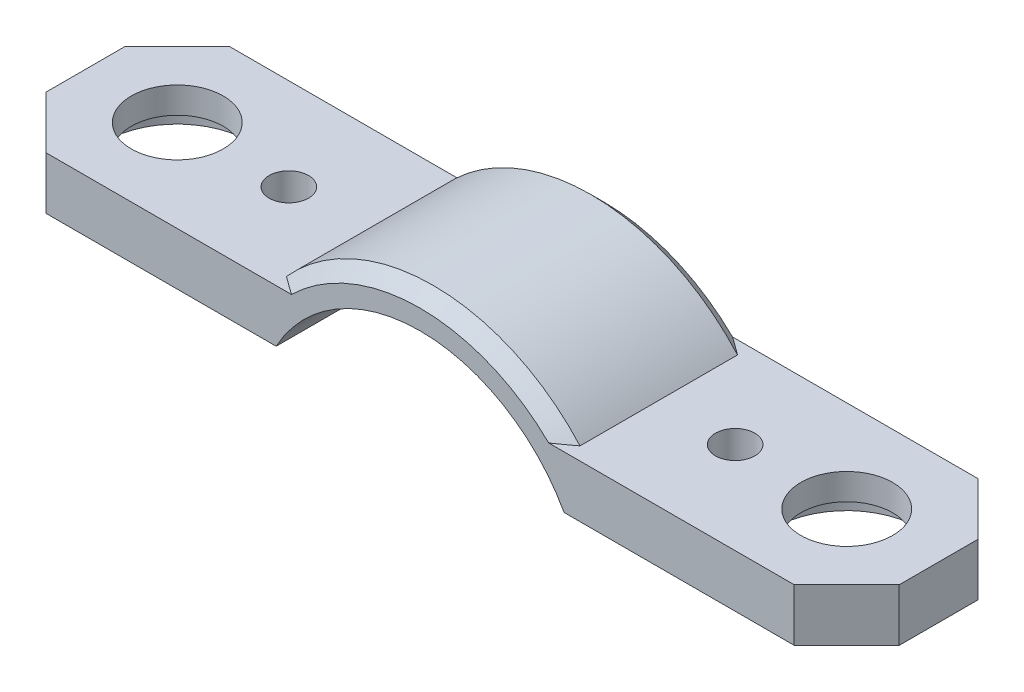
ISO-10303-21;
HEADER;
FILE_DESCRIPTION(('STEP AP214'),'2;1');
FILE_NAME('part.step','',(''),(''),'','','');
FILE_SCHEMA(('AUTOMOTIVE_DESIGN { 1 0 10303 214 1 1 1 1 }'));
ENDSEC;
DATA;
#1=APPLICATION_CONTEXT('core data for automotive mechanical design processes');
#2=APPLICATION_PROTOCOL_DEFINITION('international standard','automotive_design',2000,#1);
#3=PRODUCT_CONTEXT('',#1,'mechanical');
#4=PRODUCT('Part','Part','',(#3));
#5=PRODUCT_RELATED_PRODUCT_CATEGORY('part','',(#4));
#6=PRODUCT_DEFINITION_FORMATION('','',#4);
#7=PRODUCT_DEFINITION_CONTEXT('part definition',#1,'design');
#8=PRODUCT_DEFINITION('design','',#6,#7);
#9=PRODUCT_DEFINITION_SHAPE('','',#8);
#10=(LENGTH_UNIT() NAMED_UNIT(*) SI_UNIT(.MILLI.,.METRE.));
#11=(NAMED_UNIT(*) PLANE_ANGLE_UNIT() SI_UNIT($,.RADIAN.));
#12=(NAMED_UNIT(*) SI_UNIT($,.STERADIAN.) SOLID_ANGLE_UNIT());
#13=UNCERTAINTY_MEASURE_WITH_UNIT(LENGTH_MEASURE(1.E-05),#10,'distance_accuracy_value','');
#14=(GEOMETRIC_REPRESENTATION_CONTEXT(3) GLOBAL_UNCERTAINTY_ASSIGNED_CONTEXT((#13)) GLOBAL_UNIT_ASSIGNED_CONTEXT((#10,
#11,#12)) REPRESENTATION_CONTEXT('',''));
#15=CARTESIAN_POINT('',(0.,0.,0.));
#16=DIRECTION('',(0.,0.,1.));
#17=DIRECTION('',(1.,0.,0.));
#18=AXIS2_PLACEMENT_3D('',#15,#16,#17);
#19=CARTESIAN_POINT('',(0.,-4.,0.));
#20=DIRECTION('',(0.,1.,0.));
#21=DIRECTION('',(0.,0.,1.));
#22=AXIS2_PLACEMENT_3D('',#19,#20,#21);
#23=PLANE('',#22);
#24=CARTESIAN_POINT('',(13.6739012317805,-4.,2.35283109435819));
#25=DIRECTION('',(0.,1.,0.));
#26=DIRECTION('',(0.,0.,1.));
#27=AXIS2_PLACEMENT_3D('',#24,#25,#26);
#28=CIRCLE('',#27,1.5);
#29=CARTESIAN_POINT('',(13.6739012317805,-4.,3.85283109435819));
#30=VERTEX_POINT('',#29);
#31=EDGE_CURVE('E541',#30,#30,#28,.T.);
#32=ORIENTED_EDGE('',*,*,#31,.T.);
#33=EDGE_LOOP('',(#32));
#34=FACE_BOUND('',#33,.T.);
#35=CARTESIAN_POINT('',(22.1739012317805,-4.,2.35283109435819));
#36=DIRECTION('',(0.,-1.,0.));
#37=DIRECTION('',(0.,0.,-1.));
#38=AXIS2_PLACEMENT_3D('',#35,#36,#37);
#39=CIRCLE('',#38,5.5);
#40=CARTESIAN_POINT('',(22.1739012317805,-4.,-3.1471689056418));
#41=VERTEX_POINT('',#40);
#42=EDGE_CURVE('E287',#41,#41,#39,.T.);
#43=ORIENTED_EDGE('',*,*,#42,.F.);
#44=EDGE_LOOP('',(#43));
#45=FACE_BOUND('',#44,.T.);
#46=DIRECTION('',(0.,0.,-1.));
#47=VECTOR('',#46,1.);
#48=CARTESIAN_POINT('',(29.1739012317805,-4.,-4.64716890564181));
#49=LINE('',#48,#47);
#50=CARTESIAN_POINT('',(29.1739012317805,-4.,5.35283109435819));
#51=VERTEX_POINT('',#50);
#52=CARTESIAN_POINT('',(29.1739012317805,-4.,-0.647168905641816));
#53=VERTEX_POINT('',#52);
#54=EDGE_CURVE('E159',#51,#53,#49,.T.);
#55=ORIENTED_EDGE('',*,*,#54,.F.);
#56=DIRECTION('',(0.707106781186546,0.,-0.707106781186549));
#57=VECTOR('',#56,1.);
#58=CARTESIAN_POINT('',(25.1739012317806,-4.,9.35283109435819));
#59=LINE('',#58,#57);
#60=CARTESIAN_POINT('',(25.1739012317806,-4.,9.35283109435819));
#61=VERTEX_POINT('',#60);
#62=EDGE_CURVE('E301',#51,#61,#59,.F.);
#63=ORIENTED_EDGE('',*,*,#62,.T.);
#64=DIRECTION('',(1.,0.,0.));
#65=VECTOR('',#64,1.);
#66=CARTESIAN_POINT('',(-35.8260987682195,-4.,9.35283109435819));
#67=LINE('',#66,#65);
#68=CARTESIAN_POINT('',(7.6397573315112,-4.,9.35283109435819));
#69=VERTEX_POINT('',#68);
#70=EDGE_CURVE('E291',#69,#61,#67,.T.);
#71=ORIENTED_EDGE('',*,*,#70,.F.);
#72=DIRECTION('',(0.,0.,-1.));
#73=VECTOR('',#72,1.);
#74=CARTESIAN_POINT('',(7.6397573315112,-4.,9.35283109435819));
#75=LINE('',#74,#73);
#76=CARTESIAN_POINT('',(7.6397573315112,-4.,-4.64716890564181));
#77=VERTEX_POINT('',#76);
#78=EDGE_CURVE('E143',#69,#77,#75,.T.);
#79=ORIENTED_EDGE('',*,*,#78,.T.);
#80=DIRECTION('',(-1.,0.,0.));
#81=VECTOR('',#80,1.);
#82=CARTESIAN_POINT('',(-35.8260987682195,-4.,-4.64716890564181));
#83=LINE('',#82,#81);
#84=CARTESIAN_POINT('',(25.1739012317805,-4.,-4.64716890564181));
#85=VERTEX_POINT('',#84);
#86=EDGE_CURVE('E154',#85,#77,#83,.T.);
#87=ORIENTED_EDGE('',*,*,#86,.F.);
#88=DIRECTION('',(-0.707106781186549,0.,-0.707106781186546));
#89=VECTOR('',#88,1.);
#90=CARTESIAN_POINT('',(29.1739012317805,-4.,-0.647168905641817));
#91=LINE('',#90,#89);
#92=EDGE_CURVE('E314',#85,#53,#91,.F.);
#93=ORIENTED_EDGE('',*,*,#92,.T.);
#94=EDGE_LOOP('',(#55,#63,#71,#79,#87,#93));
#95=FACE_BOUND('',#94,.T.);
#96=ADVANCED_FACE('F33',(#34,#45,#95),#23,.F.);
#97=CARTESIAN_POINT('',(0.,0.,0.));
#98=DIRECTION('',(0.,1.,0.));
#99=DIRECTION('',(0.,0.,1.));
#100=AXIS2_PLACEMENT_3D('',#97,#98,#99);
#101=PLANE('',#100);
#102=CARTESIAN_POINT('',(13.6739012317805,0.,2.35283109435819));
#103=DIRECTION('',(0.,1.,0.));
#104=DIRECTION('',(0.,0.,1.));
#105=AXIS2_PLACEMENT_3D('',#102,#103,#104);
#106=CIRCLE('',#105,1.5);
#107=CARTESIAN_POINT('',(13.6739012317805,0.,3.85283109435819));
#108=VERTEX_POINT('',#107);
#109=EDGE_CURVE('E544',#108,#108,#106,.T.);
#110=ORIENTED_EDGE('',*,*,#109,.F.);
#111=EDGE_LOOP('',(#110));
#112=FACE_BOUND('',#111,.T.);
#113=DIRECTION('',(1.,0.,0.));
#114=VECTOR('',#113,1.);
#115=CARTESIAN_POINT('',(-35.8260987682195,0.,9.35283109435819));
#116=LINE('',#115,#114);
#117=CARTESIAN_POINT('',(6.47186020291324,0.,9.35283109435819));
#118=VERTEX_POINT('',#117);
#119=CARTESIAN_POINT('',(25.1739012317806,0.,9.35283109435819));
#120=VERTEX_POINT('',#119);
#121=EDGE_CURVE('E170',#118,#120,#116,.T.);
#122=ORIENTED_EDGE('',*,*,#121,.T.);
#123=DIRECTION('',(-0.707106781186546,0.,0.707106781186549));
#124=VECTOR('',#123,1.);
#125=CARTESIAN_POINT('',(17.2633661630694,0.,17.2633661630694));
#126=LINE('',#125,#124);
#127=CARTESIAN_POINT('',(29.1739012317805,0.,5.35283109435819));
#128=VERTEX_POINT('',#127);
#129=EDGE_CURVE('E302',#120,#128,#126,.F.);
#130=ORIENTED_EDGE('',*,*,#129,.T.);
#131=DIRECTION('',(0.,0.,-1.));
#132=VECTOR('',#131,1.);
#133=CARTESIAN_POINT('',(29.1739012317805,0.,-4.64716890564181));
#134=LINE('',#133,#132);
#135=CARTESIAN_POINT('',(29.1739012317805,0.,-0.647168905641813));
#136=VERTEX_POINT('',#135);
#137=EDGE_CURVE('E174',#128,#136,#134,.T.);
#138=ORIENTED_EDGE('',*,*,#137,.T.);
#139=DIRECTION('',(0.707106781186549,0.,0.707106781186546));
#140=VECTOR('',#139,1.);
#141=CARTESIAN_POINT('',(14.9105350687111,0.,-14.9105350687112));
#142=LINE('',#141,#140);
#143=CARTESIAN_POINT('',(25.1739012317805,0.,-4.64716890564181));
#144=VERTEX_POINT('',#143);
#145=EDGE_CURVE('E303',#136,#144,#142,.F.);
#146=ORIENTED_EDGE('',*,*,#145,.T.);
#147=DIRECTION('',(-1.,0.,0.));
#148=VECTOR('',#147,1.);
#149=CARTESIAN_POINT('',(-35.8260987682195,0.,-4.64716890564181));
#150=LINE('',#149,#148);
#151=CARTESIAN_POINT('',(6.47186020291327,0.,-4.64716890564181));
#152=VERTEX_POINT('',#151);
#153=EDGE_CURVE('E178',#144,#152,#150,.T.);
#154=ORIENTED_EDGE('',*,*,#153,.T.);
#155=CARTESIAN_POINT('',(6.47186020291327,0.,-4.64716890564181));
#156=CARTESIAN_POINT('',(6.58835406583274,0.,-4.56563878984489));
#157=CARTESIAN_POINT('',(6.7045002071197,0.,-4.48361298310186));
#158=CARTESIAN_POINT('',(6.93612812483899,0.,-4.31864203807849));
#159=CARTESIAN_POINT('',(7.05160993790389,0.,-4.23569695124202));
#160=CARTESIAN_POINT('',(7.28195258256229,0.,-4.06895087953328));
#161=CARTESIAN_POINT('',(7.39681341770906,0.,-3.98514989956645));
#162=CARTESIAN_POINT('',(7.62595525736224,0.,-3.81674548549887));
#163=CARTESIAN_POINT('',(7.74023622922977,0.,-3.7321420069802));
#164=CARTESIAN_POINT('',(7.85424111927951,0.,-3.64716890564184));
#165=B_SPLINE_CURVE_WITH_KNOTS('',3,(#155,#156,#157,#158,#159,#160,#161,#162,#163,#164),
.UNSPECIFIED.,.F.,.F.,(4,2,2,2,4),(0.,0.426567590976708,0.853111430127949,1.27965282597465,
1.70621797007616),.UNSPECIFIED.);
#166=CARTESIAN_POINT('',(7.85424111927949,0.,-3.64716890564182));
#167=VERTEX_POINT('',#166);
#168=EDGE_CURVE('E228',#152,#167,#165,.T.);
#169=ORIENTED_EDGE('',*,*,#168,.T.);
#170=DIRECTION('',(0.,0.,-1.));
#171=VECTOR('',#170,1.);
#172=CARTESIAN_POINT('',(7.85424111927949,0.,9.35283109435819));
#173=LINE('',#172,#171);
#174=CARTESIAN_POINT('',(7.85424111927949,0.,8.3528310943582));
#175=VERTEX_POINT('',#174);
#176=EDGE_CURVE('E144',#175,#167,#173,.T.);
#177=ORIENTED_EDGE('',*,*,#176,.F.);
#178=CARTESIAN_POINT('',(7.85424111927949,0.,8.3528310943582));
#179=CARTESIAN_POINT('',(7.74023622922976,0.,8.43780419569658));
#180=CARTESIAN_POINT('',(7.62595525736224,0.,8.52240767421525));
#181=CARTESIAN_POINT('',(7.39681341770905,0.,8.69081208828284));
#182=CARTESIAN_POINT('',(7.28195258256228,0.,8.77461306824967));
#183=CARTESIAN_POINT('',(7.05160993790387,0.,8.9413591399584));
#184=CARTESIAN_POINT('',(6.93612812483897,0.,9.02430422679487));
#185=CARTESIAN_POINT('',(6.70450020711968,0.,9.18927517181825));
#186=CARTESIAN_POINT('',(6.58835406583272,0.,9.2713009785613));
#187=CARTESIAN_POINT('',(6.47186020291327,0.,9.35283109435824));
#188=B_SPLINE_CURVE_WITH_KNOTS('',3,(#178,#179,#180,#181,#182,#183,#184,#185,#186,#187),
.UNSPECIFIED.,.F.,.F.,(4,2,2,2,4),(0.,0.426565144101509,0.853106539948222,1.27965037909947,
1.70621797007619),.UNSPECIFIED.);
#189=EDGE_CURVE('E197',#175,#118,#188,.T.);
#190=ORIENTED_EDGE('',*,*,#189,.T.);
#191=EDGE_LOOP('',(#122,#130,#138,#146,#154,#169,#177,#190));
#192=FACE_BOUND('',#191,.T.);
#193=CARTESIAN_POINT('',(22.1739012317805,0.,2.35283109435819));
#194=DIRECTION('',(0.,-1.,0.));
#195=DIRECTION('',(0.,0.,-1.));
#196=AXIS2_PLACEMENT_3D('',#193,#194,#195);
#197=CIRCLE('',#196,3.5);
#198=CARTESIAN_POINT('',(22.1739012317805,0.,-1.14716890564181));
#199=VERTEX_POINT('',#198);
#200=EDGE_CURVE('E554',#199,#199,#197,.T.);
#201=ORIENTED_EDGE('',*,*,#200,.T.);
#202=EDGE_LOOP('',(#201));
#203=FACE_BOUND('',#202,.T.);
#204=ADVANCED_FACE('F221',(#112,#192,#203),#101,.T.);
#205=CARTESIAN_POINT('',(-35.8260987682195,-4.,-4.64716890564181));
#206=DIRECTION('',(-1.,0.,0.));
#207=DIRECTION('',(0.,0.,1.));
#208=AXIS2_PLACEMENT_3D('',#205,#206,#207);
#209=PLANE('',#208);
#210=DIRECTION('',(0.,0.,1.));
#211=VECTOR('',#210,1.);
#212=CARTESIAN_POINT('',(-35.8260987682195,-4.,-4.64716890564181));
#213=LINE('',#212,#211);
#214=CARTESIAN_POINT('',(-35.8260987682195,-4.,-0.647168905641802));
#215=VERTEX_POINT('',#214);
#216=CARTESIAN_POINT('',(-35.8260987682195,-4.,5.3528310943582));
#217=VERTEX_POINT('',#216);
#218=EDGE_CURVE('E180',#215,#217,#213,.T.);
#219=ORIENTED_EDGE('',*,*,#218,.T.);
#220=DIRECTION('',(0.,1.,0.));
#221=VECTOR('',#220,1.);
#222=CARTESIAN_POINT('',(-35.8260987682195,-4.,5.3528310943582));
#223=LINE('',#222,#221);
#224=CARTESIAN_POINT('',(-35.8260987682195,0.,5.35283109435819));
#225=VERTEX_POINT('',#224);
#226=EDGE_CURVE('E322',#217,#225,#223,.T.);
#227=ORIENTED_EDGE('',*,*,#226,.T.);
#228=DIRECTION('',(0.,0.,1.));
#229=VECTOR('',#228,1.);
#230=CARTESIAN_POINT('',(-35.8260987682195,0.,-4.64716890564181));
#231=LINE('',#230,#229);
#232=CARTESIAN_POINT('',(-35.8260987682195,0.,-0.647168905641802));
#233=VERTEX_POINT('',#232);
#234=EDGE_CURVE('E167',#233,#225,#231,.T.);
#235=ORIENTED_EDGE('',*,*,#234,.F.);
#236=DIRECTION('',(0.,-1.,0.));
#237=VECTOR('',#236,1.);
#238=CARTESIAN_POINT('',(-35.8260987682195,-4.,-0.647168905641802));
#239=LINE('',#238,#237);
#240=EDGE_CURVE('E53',#233,#215,#239,.T.);
#241=ORIENTED_EDGE('',*,*,#240,.T.);
#242=EDGE_LOOP('',(#219,#227,#235,#241));
#243=FACE_BOUND('',#242,.T.);
#244=ADVANCED_FACE('F262',(#243),#209,.T.);
#245=CARTESIAN_POINT('',(-35.8260987682195,-4.,-4.64716890564181));
#246=DIRECTION('',(0.,0.,-1.));
#247=DIRECTION('',(-1.,0.,0.));
#248=AXIS2_PLACEMENT_3D('',#245,#246,#247);
#249=PLANE('',#248);
#250=ORIENTED_EDGE('',*,*,#153,.F.);
#251=DIRECTION('',(0.,-1.,0.));
#252=VECTOR('',#251,1.);
#253=CARTESIAN_POINT('',(25.1739012317805,-4.,-4.64716890564181));
#254=LINE('',#253,#252);
#255=EDGE_CURVE('E319',#144,#85,#254,.T.);
#256=ORIENTED_EDGE('',*,*,#255,.T.);
#257=ORIENTED_EDGE('',*,*,#86,.T.);
#258=CARTESIAN_POINT('',(-3.32609876821946,-10.,-4.64716890564181));
#259=DIRECTION('',(0.,0.,-1.));
#260=DIRECTION('',(-1.,0.,0.));
#261=AXIS2_PLACEMENT_3D('',#258,#259,#260);
#262=CIRCLE('',#261,12.5);
#263=CARTESIAN_POINT('',(-14.2919548679501,-4.,-4.64716890564181));
#264=VERTEX_POINT('',#263);
#265=EDGE_CURVE('E138',#264,#77,#262,.T.);
#266=ORIENTED_EDGE('',*,*,#265,.F.);
#267=CARTESIAN_POINT('',(-31.8260987682195,-4.,-4.64716890564181));
#268=VERTEX_POINT('',#267);
#269=EDGE_CURVE('E151',#264,#268,#83,.T.);
#270=ORIENTED_EDGE('',*,*,#269,.T.);
#271=DIRECTION('',(0.,1.,0.));
#272=VECTOR('',#271,1.);
#273=CARTESIAN_POINT('',(-31.8260987682195,-4.,-4.64716890564181));
#274=LINE('',#273,#272);
#275=CARTESIAN_POINT('',(-31.8260987682195,0.,-4.64716890564181));
#276=VERTEX_POINT('',#275);
#277=EDGE_CURVE('E317',#268,#276,#274,.T.);
#278=ORIENTED_EDGE('',*,*,#277,.T.);
#279=CARTESIAN_POINT('',(-13.1240577393522,0.,-4.64716890564181));
#280=VERTEX_POINT('',#279);
#281=EDGE_CURVE('E177',#280,#276,#150,.T.);
#282=ORIENTED_EDGE('',*,*,#281,.F.);
#283=CARTESIAN_POINT('',(-3.32609876821946,-10.,-4.64716890564181));
#284=DIRECTION('',(0.,0.,-1.));
#285=DIRECTION('',(-1.,0.,0.));
#286=AXIS2_PLACEMENT_3D('',#283,#284,#285);
#287=CIRCLE('',#286,14.);
#288=EDGE_CURVE('E194',#280,#152,#287,.T.);
#289=ORIENTED_EDGE('',*,*,#288,.T.);
#290=EDGE_LOOP('',(#250,#256,#257,#266,#270,#278,#282,#289));
#291=FACE_BOUND('',#290,.T.);
#292=ADVANCED_FACE('F149',(#291),#249,.T.);
#293=CARTESIAN_POINT('',(29.1739012317805,-4.,-4.64716890564181));
#294=DIRECTION('',(1.,0.,0.));
#295=DIRECTION('',(0.,0.,-1.));
#296=AXIS2_PLACEMENT_3D('',#293,#294,#295);
#297=PLANE('',#296);
#298=ORIENTED_EDGE('',*,*,#137,.F.);
#299=DIRECTION('',(0.,-1.,0.));
#300=VECTOR('',#299,1.);
#301=CARTESIAN_POINT('',(29.1739012317805,-4.,5.35283109435819));
#302=LINE('',#301,#300);
#303=EDGE_CURVE('E312',#128,#51,#302,.T.);
#304=ORIENTED_EDGE('',*,*,#303,.T.);
#305=ORIENTED_EDGE('',*,*,#54,.T.);
#306=DIRECTION('',(0.,1.,0.));
#307=VECTOR('',#306,1.);
#308=CARTESIAN_POINT('',(29.1739012317805,-4.,-0.647168905641817));
#309=LINE('',#308,#307);
#310=EDGE_CURVE('E309',#53,#136,#309,.T.);
#311=ORIENTED_EDGE('',*,*,#310,.T.);
#312=EDGE_LOOP('',(#298,#304,#305,#311));
#313=FACE_BOUND('',#312,.T.);
#314=ADVANCED_FACE('F272',(#313),#297,.T.);
#315=CARTESIAN_POINT('',(-35.8260987682195,-4.,9.35283109435819));
#316=DIRECTION('',(0.,0.,1.));
#317=DIRECTION('',(1.,0.,0.));
#318=AXIS2_PLACEMENT_3D('',#315,#316,#317);
#319=PLANE('',#318);
#320=ORIENTED_EDGE('',*,*,#70,.T.);
#321=DIRECTION('',(0.,1.,0.));
#322=VECTOR('',#321,1.);
#323=CARTESIAN_POINT('',(25.1739012317806,-4.,9.35283109435819));
#324=LINE('',#323,#322);
#325=EDGE_CURVE('E296',#61,#120,#324,.T.);
#326=ORIENTED_EDGE('',*,*,#325,.T.);
#327=ORIENTED_EDGE('',*,*,#121,.F.);
#328=CARTESIAN_POINT('',(-3.32609876821946,-10.,9.35283109435819));
#329=DIRECTION('',(0.,0.,1.));
#330=DIRECTION('',(1.,0.,0.));
#331=AXIS2_PLACEMENT_3D('',#328,#329,#330);
#332=CIRCLE('',#331,14.);
#333=CARTESIAN_POINT('',(-13.1240577393522,0.,9.35283109435819));
#334=VERTEX_POINT('',#333);
#335=EDGE_CURVE('E191',#118,#334,#332,.T.);
#336=ORIENTED_EDGE('',*,*,#335,.T.);
#337=CARTESIAN_POINT('',(-31.8260987682194,0.,9.35283109435819));
#338=VERTEX_POINT('',#337);
#339=EDGE_CURVE('E172',#338,#334,#116,.T.);
#340=ORIENTED_EDGE('',*,*,#339,.F.);
#341=DIRECTION('',(0.,-1.,0.));
#342=VECTOR('',#341,1.);
#343=CARTESIAN_POINT('',(-31.8260987682194,-4.,9.35283109435819));
#344=LINE('',#343,#342);
#345=CARTESIAN_POINT('',(-31.8260987682194,-4.,9.35283109435819));
#346=VERTEX_POINT('',#345);
#347=EDGE_CURVE('E304',#338,#346,#344,.T.);
#348=ORIENTED_EDGE('',*,*,#347,.T.);
#349=CARTESIAN_POINT('',(-14.2919548679501,-4.,9.35283109435819));
#350=VERTEX_POINT('',#349);
#351=EDGE_CURVE('E163',#346,#350,#67,.T.);
#352=ORIENTED_EDGE('',*,*,#351,.T.);
#353=CARTESIAN_POINT('',(-3.32609876821946,-10.,9.35283109435819));
#354=DIRECTION('',(0.,0.,-1.));
#355=DIRECTION('',(-1.,0.,0.));
#356=AXIS2_PLACEMENT_3D('',#353,#354,#355);
#357=CIRCLE('',#356,12.5);
#358=EDGE_CURVE('E141',#350,#69,#357,.T.);
#359=ORIENTED_EDGE('',*,*,#358,.T.);
#360=EDGE_LOOP('',(#320,#326,#327,#336,#340,#348,#352,#359));
#361=FACE_BOUND('',#360,.T.);
#362=ADVANCED_FACE('F267',(#361),#319,.T.);
#363=CARTESIAN_POINT('',(-20.3260987682195,-4.,2.35283109435819));
#364=DIRECTION('',(0.,1.,0.));
#365=DIRECTION('',(0.,0.,1.));
#366=AXIS2_PLACEMENT_3D('',#363,#364,#365);
#367=CIRCLE('',#366,1.5);
#368=CARTESIAN_POINT('',(-20.3260987682195,-4.,3.85283109435819));
#369=VERTEX_POINT('',#368);
#370=EDGE_CURVE('E155',#369,#369,#367,.T.);
#371=ORIENTED_EDGE('',*,*,#370,.T.);
#372=EDGE_LOOP('',(#371));
#373=FACE_BOUND('',#372,.T.);
#374=CARTESIAN_POINT('',(-28.8260987682195,-4.,2.35283109435819));
#375=DIRECTION('',(0.,-1.,0.));
#376=DIRECTION('',(0.,0.,-1.));
#377=AXIS2_PLACEMENT_3D('',#374,#375,#376);
#378=CIRCLE('',#377,5.5);
#379=CARTESIAN_POINT('',(-28.8260987682195,-4.,-3.1471689056418));
#380=VERTEX_POINT('',#379);
#381=EDGE_CURVE('E280',#380,#380,#378,.T.);
#382=ORIENTED_EDGE('',*,*,#381,.F.);
#383=EDGE_LOOP('',(#382));
#384=FACE_BOUND('',#383,.T.);
#385=ORIENTED_EDGE('',*,*,#351,.F.);
#386=DIRECTION('',(0.707106781186549,0.,0.707106781186546));
#387=VECTOR('',#386,1.);
#388=CARTESIAN_POINT('',(-35.8260987682195,-4.,5.3528310943582));
#389=LINE('',#388,#387);
#390=EDGE_CURVE('E11',#346,#217,#389,.F.);
#391=ORIENTED_EDGE('',*,*,#390,.T.);
#392=ORIENTED_EDGE('',*,*,#218,.F.);
#393=DIRECTION('',(-0.707106781186546,0.,0.707106781186549));
#394=VECTOR('',#393,1.);
#395=CARTESIAN_POINT('',(-31.8260987682195,-4.,-4.64716890564181));
#396=LINE('',#395,#394);
#397=EDGE_CURVE('E41',#215,#268,#396,.F.);
#398=ORIENTED_EDGE('',*,*,#397,.T.);
#399=ORIENTED_EDGE('',*,*,#269,.F.);
#400=DIRECTION('',(0.,0.,-1.));
#401=VECTOR('',#400,1.);
#402=CARTESIAN_POINT('',(-14.2919548679501,-4.,9.35283109435819));
#403=LINE('',#402,#401);
#404=EDGE_CURVE('E135',#264,#350,#403,.F.);
#405=ORIENTED_EDGE('',*,*,#404,.T.);
#406=EDGE_LOOP('',(#385,#391,#392,#398,#399,#405));
#407=FACE_BOUND('',#406,.T.);
#408=ADVANCED_FACE('F157',(#373,#384,#407),#23,.F.);
#409=CARTESIAN_POINT('',(-20.3260987682195,0.,2.35283109435819));
#410=DIRECTION('',(0.,1.,0.));
#411=DIRECTION('',(0.,0.,1.));
#412=AXIS2_PLACEMENT_3D('',#409,#410,#411);
#413=CIRCLE('',#412,1.5);
#414=CARTESIAN_POINT('',(-20.3260987682195,0.,3.85283109435819));
#415=VERTEX_POINT('',#414);
#416=EDGE_CURVE('E546',#415,#415,#413,.T.);
#417=ORIENTED_EDGE('',*,*,#416,.F.);
#418=EDGE_LOOP('',(#417));
#419=FACE_BOUND('',#418,.T.);
#420=ORIENTED_EDGE('',*,*,#234,.T.);
#421=DIRECTION('',(-0.707106781186549,0.,-0.707106781186546));
#422=VECTOR('',#421,1.);
#423=CARTESIAN_POINT('',(-20.5894649312888,0.,20.5894649312888));
#424=LINE('',#423,#422);
#425=EDGE_CURVE('E327',#225,#338,#424,.F.);
#426=ORIENTED_EDGE('',*,*,#425,.T.);
#427=ORIENTED_EDGE('',*,*,#339,.T.);
#428=CARTESIAN_POINT('',(-13.1240577393522,0.,9.35283109435819));
#429=CARTESIAN_POINT('',(-13.2405516022716,0.,9.27130097856128));
#430=CARTESIAN_POINT('',(-13.3566977435586,0.,9.18927517181825));
#431=CARTESIAN_POINT('',(-13.5883256612779,0.,9.02430422679488));
#432=CARTESIAN_POINT('',(-13.7038074743428,0.,8.9413591399584));
#433=CARTESIAN_POINT('',(-13.9341501190012,0.,8.77461306824967));
#434=CARTESIAN_POINT('',(-14.049010954148,0.,8.69081208828283));
#435=CARTESIAN_POINT('',(-14.2781527938012,0.,8.52240767421525));
#436=CARTESIAN_POINT('',(-14.3924337656687,0.,8.43780419569658));
#437=CARTESIAN_POINT('',(-14.5064386557184,0.,8.35283109435822));
#438=B_SPLINE_CURVE_WITH_KNOTS('',3,(#428,#429,#430,#431,#432,#433,#434,#435,#436,#437),
.UNSPECIFIED.,.F.,.F.,(4,2,2,2,4),(0.,0.426567590976716,0.853111430127964,1.27965282597467,
1.70621797007619),.UNSPECIFIED.);
#439=CARTESIAN_POINT('',(-14.5064386557184,0.,8.3528310943582));
#440=VERTEX_POINT('',#439);
#441=EDGE_CURVE('E205',#334,#440,#438,.T.);
#442=ORIENTED_EDGE('',*,*,#441,.T.);
#443=DIRECTION('',(0.,0.,-1.));
#444=VECTOR('',#443,1.);
#445=CARTESIAN_POINT('',(-14.5064386557184,0.,9.35283109435819));
#446=LINE('',#445,#444);
#447=CARTESIAN_POINT('',(-14.5064386557184,0.,-3.64716890564182));
#448=VERTEX_POINT('',#447);
#449=EDGE_CURVE('E161',#448,#440,#446,.F.);
#450=ORIENTED_EDGE('',*,*,#449,.F.);
#451=CARTESIAN_POINT('',(-14.5064386557184,0.,-3.64716890564182));
#452=CARTESIAN_POINT('',(-14.3924337656687,0.,-3.73214200698019));
#453=CARTESIAN_POINT('',(-14.2781527938012,0.,-3.81674548549887));
#454=CARTESIAN_POINT('',(-14.049010954148,0.,-3.98514989956645));
#455=CARTESIAN_POINT('',(-13.9341501190012,0.,-4.06895087953328));
#456=CARTESIAN_POINT('',(-13.7038074743428,0.,-4.23569695124201));
#457=CARTESIAN_POINT('',(-13.5883256612779,0.,-4.31864203807848));
#458=CARTESIAN_POINT('',(-13.3566977435586,0.,-4.48361298310186));
#459=CARTESIAN_POINT('',(-13.2405516022717,0.,-4.56563878984491));
#460=CARTESIAN_POINT('',(-13.1240577393522,0.,-4.64716890564185));
#461=B_SPLINE_CURVE_WITH_KNOTS('',3,(#451,#452,#453,#454,#455,#456,#457,#458,#459,#460),
.UNSPECIFIED.,.F.,.F.,(4,2,2,2,4),(0.,0.426565144101501,0.853106539948207,1.27965037909945,
1.70621797007616),.UNSPECIFIED.);
#462=EDGE_CURVE('E232',#448,#280,#461,.T.);
#463=ORIENTED_EDGE('',*,*,#462,.T.);
#464=ORIENTED_EDGE('',*,*,#281,.T.);
#465=DIRECTION('',(0.707106781186546,0.,-0.707106781186549));
#466=VECTOR('',#465,1.);
#467=CARTESIAN_POINT('',(-18.2366338369307,0.,-18.2366338369306));
#468=LINE('',#467,#466);
#469=EDGE_CURVE('E325',#276,#233,#468,.F.);
#470=ORIENTED_EDGE('',*,*,#469,.T.);
#471=EDGE_LOOP('',(#420,#426,#427,#442,#450,#463,#464,#470));
#472=FACE_BOUND('',#471,.T.);
#473=CARTESIAN_POINT('',(-28.8260987682195,0.,2.35283109435819));
#474=DIRECTION('',(0.,-1.,0.));
#475=DIRECTION('',(0.,0.,-1.));
#476=AXIS2_PLACEMENT_3D('',#473,#474,#475);
#477=CIRCLE('',#476,3.5);
#478=CARTESIAN_POINT('',(-28.8260987682195,0.,-1.14716890564181));
#479=VERTEX_POINT('',#478);
#480=EDGE_CURVE('E560',#479,#479,#477,.T.);
#481=ORIENTED_EDGE('',*,*,#480,.T.);
#482=EDGE_LOOP('',(#481));
#483=FACE_BOUND('',#482,.T.);
#484=ADVANCED_FACE('F214',(#419,#472,#483),#101,.T.);
#485=CARTESIAN_POINT('',(-28.8260987682195,-2.,2.35283109435819));
#486=DIRECTION('',(0.,-1.,0.));
#487=DIRECTION('',(0.,0.,-1.));
#488=AXIS2_PLACEMENT_3D('',#485,#486,#487);
#489=CYLINDRICAL_SURFACE('',#488,5.5);
#490=CARTESIAN_POINT('',(-28.8260987682195,-2.,2.35283109435819));
#491=DIRECTION('',(0.,-1.,0.));
#492=DIRECTION('',(0.,0.,-1.));
#493=AXIS2_PLACEMENT_3D('',#490,#491,#492);
#494=CIRCLE('',#493,5.5);
#495=CARTESIAN_POINT('',(-28.8260987682195,-2.,-3.1471689056418));
#496=VERTEX_POINT('',#495);
#497=EDGE_CURVE('E171',#496,#496,#494,.T.);
#498=ORIENTED_EDGE('',*,*,#497,.F.);
#499=EDGE_LOOP('',(#498));
#500=FACE_BOUND('',#499,.T.);
#501=ORIENTED_EDGE('',*,*,#381,.T.);
#502=EDGE_LOOP('',(#501));
#503=FACE_BOUND('',#502,.T.);
#504=ADVANCED_FACE('F219',(#500,#503),#489,.F.);
#505=CARTESIAN_POINT('',(-28.8260987682195,-2.,2.35283109435819));
#506=DIRECTION('',(0.,-1.,0.));
#507=DIRECTION('',(0.,0.,-1.));
#508=AXIS2_PLACEMENT_3D('',#505,#506,#507);
#509=PLANE('',#508);
#510=CARTESIAN_POINT('',(-28.8260987682195,-2.,2.35283109435819));
#511=DIRECTION('',(0.,-1.,0.));
#512=DIRECTION('',(0.,0.,-1.));
#513=AXIS2_PLACEMENT_3D('',#510,#511,#512);
#514=CIRCLE('',#513,3.5);
#515=CARTESIAN_POINT('',(-28.8260987682195,-2.,-1.14716890564181));
#516=VERTEX_POINT('',#515);
#517=EDGE_CURVE('E557',#516,#516,#514,.T.);
#518=ORIENTED_EDGE('',*,*,#517,.F.);
#519=EDGE_LOOP('',(#518));
#520=FACE_BOUND('',#519,.T.);
#521=ORIENTED_EDGE('',*,*,#497,.T.);
#522=EDGE_LOOP('',(#521));
#523=FACE_BOUND('',#522,.T.);
#524=ADVANCED_FACE('F379',(#520,#523),#509,.T.);
#525=CARTESIAN_POINT('',(22.1739012317805,-2.,2.35283109435819));
#526=DIRECTION('',(0.,-1.,0.));
#527=DIRECTION('',(0.,0.,-1.));
#528=AXIS2_PLACEMENT_3D('',#525,#526,#527);
#529=CYLINDRICAL_SURFACE('',#528,5.5);
#530=CARTESIAN_POINT('',(22.1739012317805,-2.,2.35283109435819));
#531=DIRECTION('',(0.,-1.,0.));
#532=DIRECTION('',(0.,0.,-1.));
#533=AXIS2_PLACEMENT_3D('',#530,#531,#532);
#534=CIRCLE('',#533,5.5);
#535=CARTESIAN_POINT('',(22.1739012317805,-2.,-3.1471689056418));
#536=VERTEX_POINT('',#535);
#537=EDGE_CURVE('E282',#536,#536,#534,.T.);
#538=ORIENTED_EDGE('',*,*,#537,.F.);
#539=EDGE_LOOP('',(#538));
#540=FACE_BOUND('',#539,.T.);
#541=ORIENTED_EDGE('',*,*,#42,.T.);
#542=EDGE_LOOP('',(#541));
#543=FACE_BOUND('',#542,.T.);
#544=ADVANCED_FACE('F375',(#540,#543),#529,.F.);
#545=CARTESIAN_POINT('',(22.1739012317805,-2.,2.35283109435819));
#546=DIRECTION('',(0.,-1.,0.));
#547=DIRECTION('',(0.,0.,-1.));
#548=AXIS2_PLACEMENT_3D('',#545,#546,#547);
#549=PLANE('',#548);
#550=CARTESIAN_POINT('',(22.1739012317805,-2.,2.35283109435819));
#551=DIRECTION('',(0.,-1.,0.));
#552=DIRECTION('',(0.,0.,-1.));
#553=AXIS2_PLACEMENT_3D('',#550,#551,#552);
#554=CIRCLE('',#553,3.5);
#555=CARTESIAN_POINT('',(22.1739012317805,-2.,-1.14716890564181));
#556=VERTEX_POINT('',#555);
#557=EDGE_CURVE('E552',#556,#556,#554,.T.);
#558=ORIENTED_EDGE('',*,*,#557,.F.);
#559=EDGE_LOOP('',(#558));
#560=FACE_BOUND('',#559,.T.);
#561=ORIENTED_EDGE('',*,*,#537,.T.);
#562=EDGE_LOOP('',(#561));
#563=FACE_BOUND('',#562,.T.);
#564=ADVANCED_FACE('F371',(#560,#563),#549,.T.);
#565=CARTESIAN_POINT('',(-28.8260987682195,0.,2.35283109435819));
#566=DIRECTION('',(0.,-1.,0.));
#567=DIRECTION('',(0.,0.,-1.));
#568=AXIS2_PLACEMENT_3D('',#565,#566,#567);
#569=CYLINDRICAL_SURFACE('',#568,3.5);
#570=ORIENTED_EDGE('',*,*,#480,.F.);
#571=EDGE_LOOP('',(#570));
#572=FACE_BOUND('',#571,.T.);
#573=ORIENTED_EDGE('',*,*,#517,.T.);
#574=EDGE_LOOP('',(#573));
#575=FACE_BOUND('',#574,.T.);
#576=ADVANCED_FACE('F364',(#572,#575),#569,.F.);
#577=CARTESIAN_POINT('',(22.1739012317805,0.,2.35283109435819));
#578=DIRECTION('',(0.,-1.,0.));
#579=DIRECTION('',(0.,0.,-1.));
#580=AXIS2_PLACEMENT_3D('',#577,#578,#579);
#581=CYLINDRICAL_SURFACE('',#580,3.5);
#582=ORIENTED_EDGE('',*,*,#200,.F.);
#583=EDGE_LOOP('',(#582));
#584=FACE_BOUND('',#583,.T.);
#585=ORIENTED_EDGE('',*,*,#557,.T.);
#586=EDGE_LOOP('',(#585));
#587=FACE_BOUND('',#586,.T.);
#588=ADVANCED_FACE('F356',(#584,#587),#581,.F.);
#589=CARTESIAN_POINT('',(-3.32609876821946,-10.,9.35283109435819));
#590=DIRECTION('',(0.,0.,-1.));
#591=DIRECTION('',(-1.,0.,0.));
#592=AXIS2_PLACEMENT_3D('',#589,#590,#591);
#593=CYLINDRICAL_SURFACE('',#592,15.);
#594=ORIENTED_EDGE('',*,*,#449,.T.);
#595=CARTESIAN_POINT('',(-3.32609876821946,-10.,8.3528310943582));
#596=DIRECTION('',(0.,0.,1.));
#597=DIRECTION('',(1.,0.,0.));
#598=AXIS2_PLACEMENT_3D('',#595,#596,#597);
#599=CIRCLE('',#598,15.);
#600=EDGE_CURVE('E188',#440,#175,#599,.F.);
#601=ORIENTED_EDGE('',*,*,#600,.T.);
#602=ORIENTED_EDGE('',*,*,#176,.T.);
#603=CARTESIAN_POINT('',(-3.32609876821946,-10.,-3.64716890564182));
#604=DIRECTION('',(0.,0.,-1.));
#605=DIRECTION('',(-1.,0.,0.));
#606=AXIS2_PLACEMENT_3D('',#603,#604,#605);
#607=CIRCLE('',#606,15.);
#608=EDGE_CURVE('E186',#167,#448,#607,.F.);
#609=ORIENTED_EDGE('',*,*,#608,.T.);
#610=EDGE_LOOP('',(#594,#601,#602,#609));
#611=FACE_BOUND('',#610,.T.);
#612=ADVANCED_FACE('F354',(#611),#593,.T.);
#613=CARTESIAN_POINT('',(-3.32609876821946,-10.,9.35283109435819));
#614=DIRECTION('',(0.,0.,-1.));
#615=DIRECTION('',(-1.,0.,0.));
#616=AXIS2_PLACEMENT_3D('',#613,#614,#615);
#617=CYLINDRICAL_SURFACE('',#616,12.5);
#618=ORIENTED_EDGE('',*,*,#358,.F.);
#619=ORIENTED_EDGE('',*,*,#404,.F.);
#620=ORIENTED_EDGE('',*,*,#265,.T.);
#621=ORIENTED_EDGE('',*,*,#78,.F.);
#622=EDGE_LOOP('',(#618,#619,#620,#621));
#623=FACE_BOUND('',#622,.T.);
#624=ADVANCED_FACE('F137',(#623),#617,.F.);
#625=CARTESIAN_POINT('',(-20.3260987682195,-4.,2.35283109435819));
#626=DIRECTION('',(0.,1.,0.));
#627=DIRECTION('',(0.,0.,1.));
#628=AXIS2_PLACEMENT_3D('',#625,#626,#627);
#629=CYLINDRICAL_SURFACE('',#628,1.5);
#630=ORIENTED_EDGE('',*,*,#370,.F.);
#631=EDGE_LOOP('',(#630));
#632=FACE_BOUND('',#631,.T.);
#633=ORIENTED_EDGE('',*,*,#416,.T.);
#634=EDGE_LOOP('',(#633));
#635=FACE_BOUND('',#634,.T.);
#636=ADVANCED_FACE('F362',(#632,#635),#629,.F.);
#637=CARTESIAN_POINT('',(13.6739012317805,-4.,2.35283109435819));
#638=DIRECTION('',(0.,1.,0.));
#639=DIRECTION('',(0.,0.,1.));
#640=AXIS2_PLACEMENT_3D('',#637,#638,#639);
#641=CYLINDRICAL_SURFACE('',#640,1.5);
#642=ORIENTED_EDGE('',*,*,#31,.F.);
#643=EDGE_LOOP('',(#642));
#644=FACE_BOUND('',#643,.T.);
#645=ORIENTED_EDGE('',*,*,#109,.T.);
#646=EDGE_LOOP('',(#645));
#647=FACE_BOUND('',#646,.T.);
#648=ADVANCED_FACE('F428',(#644,#647),#641,.F.);
#649=CARTESIAN_POINT('',(-3.32609876821946,-10.,8.3528310943582));
#650=DIRECTION('',(0.,0.,-1.));
#651=DIRECTION('',(-1.,0.,0.));
#652=AXIS2_PLACEMENT_3D('',#649,#650,#651);
#653=CONICAL_SURFACE('',#652,15.,0.785398163397454);
#654=ORIENTED_EDGE('',*,*,#441,.F.);
#655=ORIENTED_EDGE('',*,*,#335,.F.);
#656=ORIENTED_EDGE('',*,*,#189,.F.);
#657=ORIENTED_EDGE('',*,*,#600,.F.);
#658=EDGE_LOOP('',(#654,#655,#656,#657));
#659=FACE_BOUND('',#658,.T.);
#660=ADVANCED_FACE('F210',(#659),#653,.T.);
#661=CARTESIAN_POINT('',(-3.32609876821946,-10.,-4.64716890564181));
#662=DIRECTION('',(0.,0.,1.));
#663=DIRECTION('',(1.,0.,0.));
#664=AXIS2_PLACEMENT_3D('',#661,#662,#663);
#665=CONICAL_SURFACE('',#664,14.,0.785398163397447);
#666=ORIENTED_EDGE('',*,*,#462,.F.);
#667=ORIENTED_EDGE('',*,*,#608,.F.);
#668=ORIENTED_EDGE('',*,*,#168,.F.);
#669=ORIENTED_EDGE('',*,*,#288,.F.);
#670=EDGE_LOOP('',(#666,#667,#668,#669));
#671=FACE_BOUND('',#670,.T.);
#672=ADVANCED_FACE('F237',(#671),#665,.T.);
#673=CARTESIAN_POINT('',(25.1739012317806,-4.,9.35283109435819));
#674=DIRECTION('',(-0.707106781186549,0.,-0.707106781186546));
#675=DIRECTION('',(0.,1.,0.));
#676=AXIS2_PLACEMENT_3D('',#673,#674,#675);
#677=PLANE('',#676);
#678=ORIENTED_EDGE('',*,*,#62,.F.);
#679=ORIENTED_EDGE('',*,*,#303,.F.);
#680=ORIENTED_EDGE('',*,*,#129,.F.);
#681=ORIENTED_EDGE('',*,*,#325,.F.);
#682=EDGE_LOOP('',(#678,#679,#680,#681));
#683=FACE_BOUND('',#682,.T.);
#684=ADVANCED_FACE('F241',(#683),#677,.F.);
#685=CARTESIAN_POINT('',(29.1739012317805,-4.,-0.647168905641817));
#686=DIRECTION('',(-0.707106781186546,0.,0.707106781186549));
#687=DIRECTION('',(0.,1.,0.));
#688=AXIS2_PLACEMENT_3D('',#685,#686,#687);
#689=PLANE('',#688);
#690=ORIENTED_EDGE('',*,*,#92,.F.);
#691=ORIENTED_EDGE('',*,*,#255,.F.);
#692=ORIENTED_EDGE('',*,*,#145,.F.);
#693=ORIENTED_EDGE('',*,*,#310,.F.);
#694=EDGE_LOOP('',(#690,#691,#692,#693));
#695=FACE_BOUND('',#694,.T.);
#696=ADVANCED_FACE('F246',(#695),#689,.F.);
#697=CARTESIAN_POINT('',(-35.8260987682195,-4.,5.3528310943582));
#698=DIRECTION('',(0.707106781186546,0.,-0.707106781186549));
#699=DIRECTION('',(0.,1.,0.));
#700=AXIS2_PLACEMENT_3D('',#697,#698,#699);
#701=PLANE('',#700);
#702=ORIENTED_EDGE('',*,*,#390,.F.);
#703=ORIENTED_EDGE('',*,*,#347,.F.);
#704=ORIENTED_EDGE('',*,*,#425,.F.);
#705=ORIENTED_EDGE('',*,*,#226,.F.);
#706=EDGE_LOOP('',(#702,#703,#704,#705));
#707=FACE_BOUND('',#706,.T.);
#708=ADVANCED_FACE('F249',(#707),#701,.F.);
#709=CARTESIAN_POINT('',(-31.8260987682195,-4.,-4.64716890564181));
#710=DIRECTION('',(0.707106781186549,0.,0.707106781186546));
#711=DIRECTION('',(0.,1.,0.));
#712=AXIS2_PLACEMENT_3D('',#709,#710,#711);
#713=PLANE('',#712);
#714=ORIENTED_EDGE('',*,*,#397,.F.);
#715=ORIENTED_EDGE('',*,*,#240,.F.);
#716=ORIENTED_EDGE('',*,*,#469,.F.);
#717=ORIENTED_EDGE('',*,*,#277,.F.);
#718=EDGE_LOOP('',(#714,#715,#716,#717));
#719=FACE_BOUND('',#718,.T.);
#720=ADVANCED_FACE('F35',(#719),#713,.F.);
#721=CLOSED_SHELL('',(#96,#204,#244,#292,#314,#362,#408,#484,#504,#524,#544,#564,#576,#588,#612,
#624,#636,#648,#660,#672,#684,#696,#708,#720));
#722=MANIFOLD_SOLID_BREP('B2',#721);
#723=ADVANCED_BREP_SHAPE_REPRESENTATION('',(#18,#722),#14);
#724=SHAPE_DEFINITION_REPRESENTATION(#9,#723);
ENDSEC;
END-ISO-10303-21;
